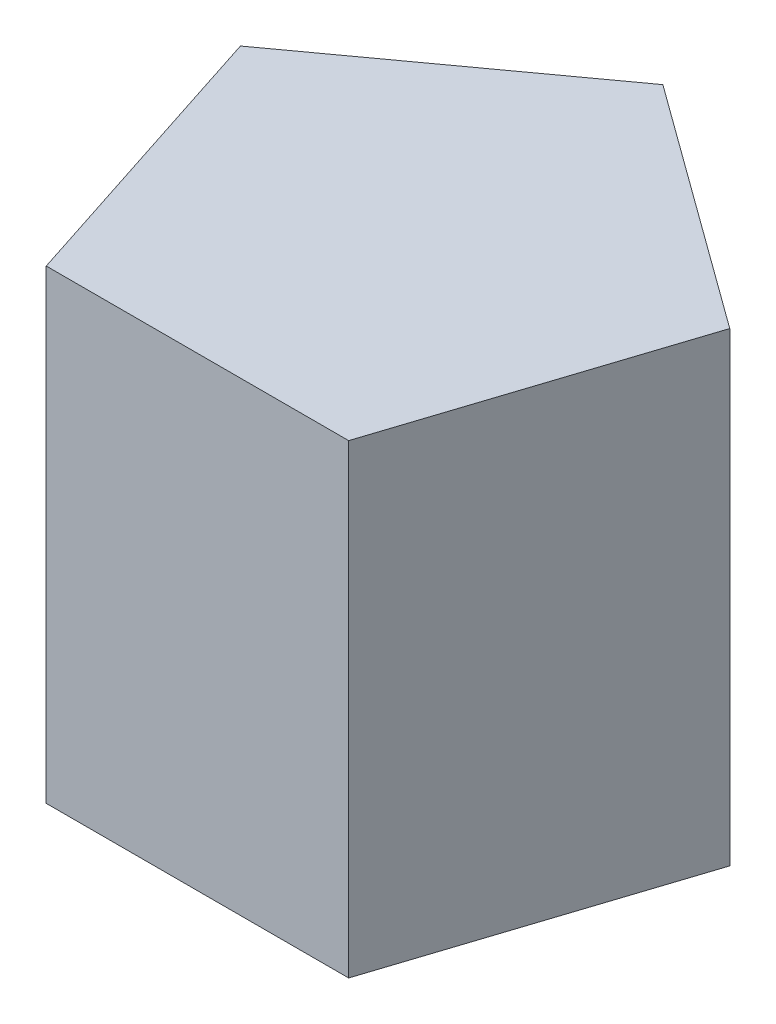
ISO-10303-21;
HEADER;
FILE_DESCRIPTION(('STEP AP214'),'2;1');
FILE_NAME('part.step','',(''),(''),'','','');
FILE_SCHEMA(('AUTOMOTIVE_DESIGN { 1 0 10303 214 1 1 1 1 }'));
ENDSEC;
DATA;
#1=APPLICATION_CONTEXT('core data for automotive mechanical design processes');
#2=APPLICATION_PROTOCOL_DEFINITION('international standard','automotive_design',2000,#1);
#3=PRODUCT_CONTEXT('',#1,'mechanical');
#4=PRODUCT('Part','Part','',(#3));
#5=PRODUCT_RELATED_PRODUCT_CATEGORY('part','',(#4));
#6=PRODUCT_DEFINITION_FORMATION('','',#4);
#7=PRODUCT_DEFINITION_CONTEXT('part definition',#1,'design');
#8=PRODUCT_DEFINITION('design','',#6,#7);
#9=PRODUCT_DEFINITION_SHAPE('','',#8);
#10=(LENGTH_UNIT() NAMED_UNIT(*) SI_UNIT(.MILLI.,.METRE.));
#11=(NAMED_UNIT(*) PLANE_ANGLE_UNIT() SI_UNIT($,.RADIAN.));
#12=(NAMED_UNIT(*) SI_UNIT($,.STERADIAN.) SOLID_ANGLE_UNIT());
#13=UNCERTAINTY_MEASURE_WITH_UNIT(LENGTH_MEASURE(1.E-05),#10,'distance_accuracy_value','');
#14=(GEOMETRIC_REPRESENTATION_CONTEXT(3) GLOBAL_UNCERTAINTY_ASSIGNED_CONTEXT((#13)) GLOBAL_UNIT_ASSIGNED_CONTEXT((#10,
#11,#12)) REPRESENTATION_CONTEXT('',''));
#15=CARTESIAN_POINT('',(0.,0.,0.));
#16=DIRECTION('',(0.,0.,1.));
#17=DIRECTION('',(1.,0.,0.));
#18=AXIS2_PLACEMENT_3D('',#15,#16,#17);
#19=CARTESIAN_POINT('',(0.,25.,-27.6393202250021));
#20=DIRECTION('',(0.587785252292473,0.,0.809016994374947));
#21=DIRECTION('',(0.809016994374947,0.,-0.587785252292473));
#22=AXIS2_PLACEMENT_3D('',#19,#20,#21);
#23=PLANE('',#22);
#24=DIRECTION('',(-0.809016994374947,0.,0.587785252292474));
#25=VECTOR('',#24,1.);
#26=CARTESIAN_POINT('',(0.,-25.,-27.6393202250021));
#27=LINE('',#26,#25);
#28=CARTESIAN_POINT('',(0.,-25.,-27.6393202250021));
#29=VERTEX_POINT('',#28);
#30=CARTESIAN_POINT('',(-26.2865556059567,-25.,-8.54101966249684));
#31=VERTEX_POINT('',#30);
#32=EDGE_CURVE('E113',#29,#31,#27,.T.);
#33=ORIENTED_EDGE('',*,*,#32,.T.);
#34=DIRECTION('',(0.,-1.,0.));
#35=VECTOR('',#34,1.);
#36=CARTESIAN_POINT('',(-26.2865556059567,25.,-8.54101966249684));
#37=LINE('',#36,#35);
#38=CARTESIAN_POINT('',(-26.2865556059567,25.,-8.54101966249684));
#39=VERTEX_POINT('',#38);
#40=EDGE_CURVE('E11',#39,#31,#37,.T.);
#41=ORIENTED_EDGE('',*,*,#40,.F.);
#42=DIRECTION('',(-0.809016994374947,0.,0.587785252292474));
#43=VECTOR('',#42,1.);
#44=CARTESIAN_POINT('',(0.,25.,-27.6393202250021));
#45=LINE('',#44,#43);
#46=CARTESIAN_POINT('',(0.,25.,-27.6393202250021));
#47=VERTEX_POINT('',#46);
#48=EDGE_CURVE('E121',#47,#39,#45,.T.);
#49=ORIENTED_EDGE('',*,*,#48,.F.);
#50=DIRECTION('',(0.,-1.,0.));
#51=VECTOR('',#50,1.);
#52=CARTESIAN_POINT('',(0.,25.,-27.6393202250021));
#53=LINE('',#52,#51);
#54=EDGE_CURVE('E109',#47,#29,#53,.T.);
#55=ORIENTED_EDGE('',*,*,#54,.T.);
#56=EDGE_LOOP('',(#33,#41,#49,#55));
#57=FACE_BOUND('',#56,.T.);
#58=ADVANCED_FACE('F39',(#57),#23,.F.);
#59=CARTESIAN_POINT('',(-26.2865556059567,25.,-8.54101966249684));
#60=DIRECTION('',(0.951056516295154,0.,-0.309016994374947));
#61=DIRECTION('',(-0.309016994374947,0.,-0.951056516295154));
#62=AXIS2_PLACEMENT_3D('',#59,#60,#61);
#63=PLANE('',#62);
#64=DIRECTION('',(0.309016994374947,0.,0.951056516295154));
#65=VECTOR('',#64,1.);
#66=CARTESIAN_POINT('',(-26.2865556059567,-25.,-8.54101966249684));
#67=LINE('',#66,#65);
#68=CARTESIAN_POINT('',(-16.2459848116453,-25.,22.3606797749979));
#69=VERTEX_POINT('',#68);
#70=EDGE_CURVE('E116',#31,#69,#67,.T.);
#71=ORIENTED_EDGE('',*,*,#70,.T.);
#72=DIRECTION('',(0.,-1.,0.));
#73=VECTOR('',#72,1.);
#74=CARTESIAN_POINT('',(-16.2459848116453,25.,22.3606797749979));
#75=LINE('',#74,#73);
#76=CARTESIAN_POINT('',(-16.2459848116453,25.,22.3606797749979));
#77=VERTEX_POINT('',#76);
#78=EDGE_CURVE('E47',#77,#69,#75,.T.);
#79=ORIENTED_EDGE('',*,*,#78,.F.);
#80=DIRECTION('',(0.309016994374947,0.,0.951056516295154));
#81=VECTOR('',#80,1.);
#82=CARTESIAN_POINT('',(-26.2865556059567,25.,-8.54101966249684));
#83=LINE('',#82,#81);
#84=EDGE_CURVE('E89',#39,#77,#83,.T.);
#85=ORIENTED_EDGE('',*,*,#84,.F.);
#86=ORIENTED_EDGE('',*,*,#40,.T.);
#87=EDGE_LOOP('',(#71,#79,#85,#86));
#88=FACE_BOUND('',#87,.T.);
#89=ADVANCED_FACE('F140',(#88),#63,.F.);
#90=CARTESIAN_POINT('',(-16.2459848116453,25.,22.3606797749979));
#91=DIRECTION('',(0.,0.,-1.));
#92=DIRECTION('',(-1.,0.,0.));
#93=AXIS2_PLACEMENT_3D('',#90,#91,#92);
#94=PLANE('',#93);
#95=DIRECTION('',(1.,0.,0.));
#96=VECTOR('',#95,1.);
#97=CARTESIAN_POINT('',(-16.2459848116453,-25.,22.3606797749979));
#98=LINE('',#97,#96);
#99=CARTESIAN_POINT('',(16.2459848116453,-25.,22.3606797749979));
#100=VERTEX_POINT('',#99);
#101=EDGE_CURVE('E104',#69,#100,#98,.T.);
#102=ORIENTED_EDGE('',*,*,#101,.T.);
#103=DIRECTION('',(0.,-1.,0.));
#104=VECTOR('',#103,1.);
#105=CARTESIAN_POINT('',(16.2459848116453,25.,22.3606797749979));
#106=LINE('',#105,#104);
#107=CARTESIAN_POINT('',(16.2459848116453,25.,22.3606797749979));
#108=VERTEX_POINT('',#107);
#109=EDGE_CURVE('E101',#108,#100,#106,.T.);
#110=ORIENTED_EDGE('',*,*,#109,.F.);
#111=DIRECTION('',(1.,0.,0.));
#112=VECTOR('',#111,1.);
#113=CARTESIAN_POINT('',(-16.2459848116453,25.,22.3606797749979));
#114=LINE('',#113,#112);
#115=EDGE_CURVE('E93',#77,#108,#114,.T.);
#116=ORIENTED_EDGE('',*,*,#115,.F.);
#117=ORIENTED_EDGE('',*,*,#78,.T.);
#118=EDGE_LOOP('',(#102,#110,#116,#117));
#119=FACE_BOUND('',#118,.T.);
#120=ADVANCED_FACE('F102',(#119),#94,.F.);
#121=CARTESIAN_POINT('',(16.2459848116453,25.,22.3606797749979));
#122=DIRECTION('',(-0.951056516295154,0.,-0.309016994374948));
#123=DIRECTION('',(-0.309016994374948,0.,0.951056516295154));
#124=AXIS2_PLACEMENT_3D('',#121,#122,#123);
#125=PLANE('',#124);
#126=DIRECTION('',(0.309016994374948,0.,-0.951056516295154));
#127=VECTOR('',#126,1.);
#128=CARTESIAN_POINT('',(16.2459848116453,-25.,22.3606797749979));
#129=LINE('',#128,#127);
#130=CARTESIAN_POINT('',(26.2865556059567,-25.,-8.54101966249684));
#131=VERTEX_POINT('',#130);
#132=EDGE_CURVE('E75',#100,#131,#129,.T.);
#133=ORIENTED_EDGE('',*,*,#132,.T.);
#134=DIRECTION('',(0.,-1.,0.));
#135=VECTOR('',#134,1.);
#136=CARTESIAN_POINT('',(26.2865556059567,25.,-8.54101966249684));
#137=LINE('',#136,#135);
#138=CARTESIAN_POINT('',(26.2865556059567,25.,-8.54101966249684));
#139=VERTEX_POINT('',#138);
#140=EDGE_CURVE('E105',#139,#131,#137,.T.);
#141=ORIENTED_EDGE('',*,*,#140,.F.);
#142=DIRECTION('',(0.309016994374948,0.,-0.951056516295154));
#143=VECTOR('',#142,1.);
#144=CARTESIAN_POINT('',(16.2459848116453,25.,22.3606797749979));
#145=LINE('',#144,#143);
#146=EDGE_CURVE('E97',#108,#139,#145,.T.);
#147=ORIENTED_EDGE('',*,*,#146,.F.);
#148=ORIENTED_EDGE('',*,*,#109,.T.);
#149=EDGE_LOOP('',(#133,#141,#147,#148));
#150=FACE_BOUND('',#149,.T.);
#151=ADVANCED_FACE('F107',(#150),#125,.F.);
#152=CARTESIAN_POINT('',(26.2865556059567,25.,-8.54101966249684));
#153=DIRECTION('',(-0.587785252292473,0.,0.809016994374948));
#154=DIRECTION('',(0.809016994374948,0.,0.587785252292473));
#155=AXIS2_PLACEMENT_3D('',#152,#153,#154);
#156=PLANE('',#155);
#157=DIRECTION('',(-0.809016994374948,0.,-0.587785252292473));
#158=VECTOR('',#157,1.);
#159=CARTESIAN_POINT('',(26.2865556059567,-25.,-8.54101966249684));
#160=LINE('',#159,#158);
#161=EDGE_CURVE('E81',#131,#29,#160,.T.);
#162=ORIENTED_EDGE('',*,*,#161,.T.);
#163=ORIENTED_EDGE('',*,*,#54,.F.);
#164=DIRECTION('',(-0.809016994374948,0.,-0.587785252292473));
#165=VECTOR('',#164,1.);
#166=CARTESIAN_POINT('',(26.2865556059567,25.,-8.54101966249684));
#167=LINE('',#166,#165);
#168=EDGE_CURVE('E55',#139,#47,#167,.T.);
#169=ORIENTED_EDGE('',*,*,#168,.F.);
#170=ORIENTED_EDGE('',*,*,#140,.T.);
#171=EDGE_LOOP('',(#162,#163,#169,#170));
#172=FACE_BOUND('',#171,.T.);
#173=ADVANCED_FACE('F129',(#172),#156,.F.);
#174=CARTESIAN_POINT('',(0.,25.,0.));
#175=DIRECTION('',(0.,1.,0.));
#176=DIRECTION('',(0.,0.,1.));
#177=AXIS2_PLACEMENT_3D('',#174,#175,#176);
#178=PLANE('',#177);
#179=ORIENTED_EDGE('',*,*,#48,.T.);
#180=ORIENTED_EDGE('',*,*,#84,.T.);
#181=ORIENTED_EDGE('',*,*,#115,.T.);
#182=ORIENTED_EDGE('',*,*,#146,.T.);
#183=ORIENTED_EDGE('',*,*,#168,.T.);
#184=EDGE_LOOP('',(#179,#180,#181,#182,#183));
#185=FACE_BOUND('',#184,.T.);
#186=ADVANCED_FACE('F95',(#185),#178,.T.);
#187=CARTESIAN_POINT('',(0.,-25.,0.));
#188=DIRECTION('',(0.,1.,0.));
#189=DIRECTION('',(0.,0.,1.));
#190=AXIS2_PLACEMENT_3D('',#187,#188,#189);
#191=PLANE('',#190);
#192=ORIENTED_EDGE('',*,*,#32,.F.);
#193=ORIENTED_EDGE('',*,*,#161,.F.);
#194=ORIENTED_EDGE('',*,*,#132,.F.);
#195=ORIENTED_EDGE('',*,*,#101,.F.);
#196=ORIENTED_EDGE('',*,*,#70,.F.);
#197=EDGE_LOOP('',(#192,#193,#194,#195,#196));
#198=FACE_BOUND('',#197,.T.);
#199=ADVANCED_FACE('F125',(#198),#191,.F.);
#200=CLOSED_SHELL('',(#58,#89,#120,#151,#173,#186,#199));
#201=MANIFOLD_SOLID_BREP('B2',#200);
#202=ADVANCED_BREP_SHAPE_REPRESENTATION('',(#18,#201),#14);
#203=SHAPE_DEFINITION_REPRESENTATION(#9,#202);
ENDSEC;
END-ISO-10303-21;
